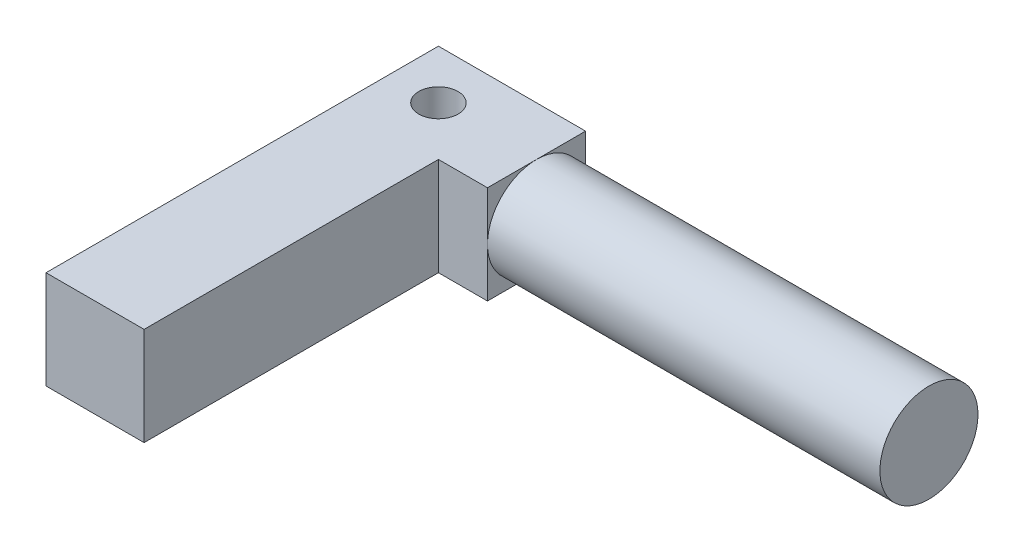
ISO-10303-21;
HEADER;
FILE_DESCRIPTION(('STEP AP214'),'2;1');
FILE_NAME('part.step','',(''),(''),'','','');
FILE_SCHEMA(('AUTOMOTIVE_DESIGN { 1 0 10303 214 1 1 1 1 }'));
ENDSEC;
DATA;
#1=APPLICATION_CONTEXT('core data for automotive mechanical design processes');
#2=APPLICATION_PROTOCOL_DEFINITION('international standard','automotive_design',2000,#1);
#3=PRODUCT_CONTEXT('',#1,'mechanical');
#4=PRODUCT('Part','Part','',(#3));
#5=PRODUCT_RELATED_PRODUCT_CATEGORY('part','',(#4));
#6=PRODUCT_DEFINITION_FORMATION('','',#4);
#7=PRODUCT_DEFINITION_CONTEXT('part definition',#1,'design');
#8=PRODUCT_DEFINITION('design','',#6,#7);
#9=PRODUCT_DEFINITION_SHAPE('','',#8);
#10=(LENGTH_UNIT() NAMED_UNIT(*) SI_UNIT(.MILLI.,.METRE.));
#11=(NAMED_UNIT(*) PLANE_ANGLE_UNIT() SI_UNIT($,.RADIAN.));
#12=(NAMED_UNIT(*) SI_UNIT($,.STERADIAN.) SOLID_ANGLE_UNIT());
#13=UNCERTAINTY_MEASURE_WITH_UNIT(LENGTH_MEASURE(1.E-05),#10,'distance_accuracy_value','');
#14=(GEOMETRIC_REPRESENTATION_CONTEXT(3) GLOBAL_UNCERTAINTY_ASSIGNED_CONTEXT((#13)) GLOBAL_UNIT_ASSIGNED_CONTEXT((#10,
#11,#12)) REPRESENTATION_CONTEXT('',''));
#15=CARTESIAN_POINT('',(0.,0.,0.));
#16=DIRECTION('',(0.,0.,1.));
#17=DIRECTION('',(1.,0.,0.));
#18=AXIS2_PLACEMENT_3D('',#15,#16,#17);
#19=CARTESIAN_POINT('',(50.,50.,-25.));
#20=DIRECTION('',(1.,0.,0.));
#21=DIRECTION('',(0.,0.,-1.));
#22=AXIS2_PLACEMENT_3D('',#19,#20,#21);
#23=PLANE('',#22);
#24=CARTESIAN_POINT('',(50.,25.,0.));
#25=DIRECTION('',(1.,0.,0.));
#26=DIRECTION('',(0.,0.,-1.));
#27=AXIS2_PLACEMENT_3D('',#24,#25,#26);
#28=CIRCLE('',#27,25.);
#29=CARTESIAN_POINT('',(50.,25.,-25.));
#30=VERTEX_POINT('',#29);
#31=CARTESIAN_POINT('',(50.,50.,0.));
#32=VERTEX_POINT('',#31);
#33=EDGE_CURVE('E57',#30,#32,#28,.T.);
#34=ORIENTED_EDGE('',*,*,#33,.F.);
#35=DIRECTION('',(0.,-1.,0.));
#36=VECTOR('',#35,1.);
#37=CARTESIAN_POINT('',(50.,50.,-25.));
#38=LINE('',#37,#36);
#39=CARTESIAN_POINT('',(50.,50.,-25.));
#40=VERTEX_POINT('',#39);
#41=EDGE_CURVE('E112',#40,#30,#38,.T.);
#42=ORIENTED_EDGE('',*,*,#41,.F.);
#43=DIRECTION('',(0.,0.,1.));
#44=VECTOR('',#43,1.);
#45=CARTESIAN_POINT('',(50.,50.,-25.));
#46=LINE('',#45,#44);
#47=EDGE_CURVE('E136',#40,#32,#46,.T.);
#48=ORIENTED_EDGE('',*,*,#47,.T.);
#49=EDGE_LOOP('',(#34,#42,#48));
#50=FACE_BOUND('',#49,.T.);
#51=ADVANCED_FACE('F45',(#50),#23,.T.);
#52=CARTESIAN_POINT('',(50.,25.,25.));
#53=VERTEX_POINT('',#52);
#54=EDGE_CURVE('E11',#32,#53,#28,.T.);
#55=ORIENTED_EDGE('',*,*,#54,.F.);
#56=CARTESIAN_POINT('',(50.,50.,25.));
#57=VERTEX_POINT('',#56);
#58=EDGE_CURVE('E159',#32,#57,#46,.T.);
#59=ORIENTED_EDGE('',*,*,#58,.T.);
#60=DIRECTION('',(0.,-1.,0.));
#61=VECTOR('',#60,1.);
#62=CARTESIAN_POINT('',(50.,50.,25.));
#63=LINE('',#62,#61);
#64=EDGE_CURVE('E49',#57,#53,#63,.T.);
#65=ORIENTED_EDGE('',*,*,#64,.T.);
#66=EDGE_LOOP('',(#55,#59,#65));
#67=FACE_BOUND('',#66,.T.);
#68=ADVANCED_FACE('F245',(#67),#23,.T.);
#69=CARTESIAN_POINT('',(50.,0.,0.));
#70=VERTEX_POINT('',#69);
#71=EDGE_CURVE('E55',#53,#70,#28,.T.);
#72=ORIENTED_EDGE('',*,*,#71,.F.);
#73=CARTESIAN_POINT('',(50.,0.,25.));
#74=VERTEX_POINT('',#73);
#75=EDGE_CURVE('E125',#53,#74,#63,.T.);
#76=ORIENTED_EDGE('',*,*,#75,.T.);
#77=DIRECTION('',(0.,0.,1.));
#78=VECTOR('',#77,1.);
#79=CARTESIAN_POINT('',(50.,0.,-25.));
#80=LINE('',#79,#78);
#81=EDGE_CURVE('E179',#70,#74,#80,.T.);
#82=ORIENTED_EDGE('',*,*,#81,.F.);
#83=EDGE_LOOP('',(#72,#76,#82));
#84=FACE_BOUND('',#83,.T.);
#85=ADVANCED_FACE('F249',(#84),#23,.T.);
#86=CARTESIAN_POINT('',(25.,50.,25.));
#87=DIRECTION('',(0.,0.,-1.));
#88=DIRECTION('',(-1.,0.,0.));
#89=AXIS2_PLACEMENT_3D('',#86,#87,#88);
#90=PLANE('',#89);
#91=DIRECTION('',(1.,0.,0.));
#92=VECTOR('',#91,1.);
#93=CARTESIAN_POINT('',(25.,0.,25.));
#94=LINE('',#93,#92);
#95=CARTESIAN_POINT('',(25.,0.,25.));
#96=VERTEX_POINT('',#95);
#97=EDGE_CURVE('E150',#96,#74,#94,.T.);
#98=ORIENTED_EDGE('',*,*,#97,.T.);
#99=ORIENTED_EDGE('',*,*,#75,.F.);
#100=ORIENTED_EDGE('',*,*,#64,.F.);
#101=DIRECTION('',(1.,0.,0.));
#102=VECTOR('',#101,1.);
#103=CARTESIAN_POINT('',(25.,50.,25.));
#104=LINE('',#103,#102);
#105=CARTESIAN_POINT('',(25.,50.,25.));
#106=VERTEX_POINT('',#105);
#107=EDGE_CURVE('E155',#106,#57,#104,.T.);
#108=ORIENTED_EDGE('',*,*,#107,.F.);
#109=DIRECTION('',(0.,-1.,0.));
#110=VECTOR('',#109,1.);
#111=CARTESIAN_POINT('',(25.,50.,25.));
#112=LINE('',#111,#110);
#113=EDGE_CURVE('E175',#106,#96,#112,.T.);
#114=ORIENTED_EDGE('',*,*,#113,.T.);
#115=EDGE_LOOP('',(#98,#99,#100,#108,#114));
#116=FACE_BOUND('',#115,.T.);
#117=ADVANCED_FACE('F47',(#116),#90,.F.);
#118=EDGE_CURVE('E130',#70,#30,#28,.T.);
#119=ORIENTED_EDGE('',*,*,#118,.F.);
#120=CARTESIAN_POINT('',(50.,0.,-25.));
#121=VERTEX_POINT('',#120);
#122=EDGE_CURVE('E132',#121,#70,#80,.T.);
#123=ORIENTED_EDGE('',*,*,#122,.F.);
#124=EDGE_CURVE('E116',#30,#121,#38,.T.);
#125=ORIENTED_EDGE('',*,*,#124,.F.);
#126=EDGE_LOOP('',(#119,#123,#125));
#127=FACE_BOUND('',#126,.T.);
#128=ADVANCED_FACE('F128',(#127),#23,.T.);
#129=CARTESIAN_POINT('',(-25.,50.,-25.));
#130=DIRECTION('',(0.,0.,-1.));
#131=DIRECTION('',(-1.,0.,0.));
#132=AXIS2_PLACEMENT_3D('',#129,#130,#131);
#133=PLANE('',#132);
#134=DIRECTION('',(1.,0.,0.));
#135=VECTOR('',#134,1.);
#136=CARTESIAN_POINT('',(-25.,0.,-25.));
#137=LINE('',#136,#135);
#138=CARTESIAN_POINT('',(-25.,0.,-25.));
#139=VERTEX_POINT('',#138);
#140=EDGE_CURVE('E182',#139,#121,#137,.T.);
#141=ORIENTED_EDGE('',*,*,#140,.F.);
#142=DIRECTION('',(0.,-1.,0.));
#143=VECTOR('',#142,1.);
#144=CARTESIAN_POINT('',(-25.,50.,-25.));
#145=LINE('',#144,#143);
#146=CARTESIAN_POINT('',(-25.,50.,-25.));
#147=VERTEX_POINT('',#146);
#148=EDGE_CURVE('E134',#147,#139,#145,.T.);
#149=ORIENTED_EDGE('',*,*,#148,.F.);
#150=DIRECTION('',(1.,0.,0.));
#151=VECTOR('',#150,1.);
#152=CARTESIAN_POINT('',(25.,50.,-25.));
#153=LINE('',#152,#151);
#154=EDGE_CURVE('E119',#147,#40,#153,.T.);
#155=ORIENTED_EDGE('',*,*,#154,.T.);
#156=ORIENTED_EDGE('',*,*,#41,.T.);
#157=ORIENTED_EDGE('',*,*,#124,.T.);
#158=EDGE_LOOP('',(#141,#149,#155,#156,#157));
#159=FACE_BOUND('',#158,.T.);
#160=ADVANCED_FACE('F115',(#159),#133,.T.);
#161=CARTESIAN_POINT('',(-25.,50.,-25.));
#162=DIRECTION('',(1.,0.,0.));
#163=DIRECTION('',(0.,0.,-1.));
#164=AXIS2_PLACEMENT_3D('',#161,#162,#163);
#165=PLANE('',#164);
#166=DIRECTION('',(0.,0.,1.));
#167=VECTOR('',#166,1.);
#168=CARTESIAN_POINT('',(-25.,0.,-25.));
#169=LINE('',#168,#167);
#170=CARTESIAN_POINT('',(-25.,0.,175.));
#171=VERTEX_POINT('',#170);
#172=EDGE_CURVE('E185',#139,#171,#169,.T.);
#173=ORIENTED_EDGE('',*,*,#172,.T.);
#174=DIRECTION('',(0.,-1.,0.));
#175=VECTOR('',#174,1.);
#176=CARTESIAN_POINT('',(-25.,50.,175.));
#177=LINE('',#176,#175);
#178=CARTESIAN_POINT('',(-25.,50.,175.));
#179=VERTEX_POINT('',#178);
#180=EDGE_CURVE('E200',#179,#171,#177,.T.);
#181=ORIENTED_EDGE('',*,*,#180,.F.);
#182=DIRECTION('',(0.,0.,1.));
#183=VECTOR('',#182,1.);
#184=CARTESIAN_POINT('',(-25.,50.,-25.));
#185=LINE('',#184,#183);
#186=EDGE_CURVE('E165',#147,#179,#185,.T.);
#187=ORIENTED_EDGE('',*,*,#186,.F.);
#188=ORIENTED_EDGE('',*,*,#148,.T.);
#189=EDGE_LOOP('',(#173,#181,#187,#188));
#190=FACE_BOUND('',#189,.T.);
#191=ADVANCED_FACE('F208',(#190),#165,.F.);
#192=CARTESIAN_POINT('',(-25.,50.,175.));
#193=DIRECTION('',(0.,0.,-1.));
#194=DIRECTION('',(-1.,0.,0.));
#195=AXIS2_PLACEMENT_3D('',#192,#193,#194);
#196=PLANE('',#195);
#197=DIRECTION('',(1.,0.,0.));
#198=VECTOR('',#197,1.);
#199=CARTESIAN_POINT('',(-25.,0.,175.));
#200=LINE('',#199,#198);
#201=CARTESIAN_POINT('',(25.,0.,175.));
#202=VERTEX_POINT('',#201);
#203=EDGE_CURVE('E188',#171,#202,#200,.T.);
#204=ORIENTED_EDGE('',*,*,#203,.T.);
#205=DIRECTION('',(0.,-1.,0.));
#206=VECTOR('',#205,1.);
#207=CARTESIAN_POINT('',(25.,50.,175.));
#208=LINE('',#207,#206);
#209=CARTESIAN_POINT('',(25.,50.,175.));
#210=VERTEX_POINT('',#209);
#211=EDGE_CURVE('E197',#210,#202,#208,.T.);
#212=ORIENTED_EDGE('',*,*,#211,.F.);
#213=DIRECTION('',(1.,0.,0.));
#214=VECTOR('',#213,1.);
#215=CARTESIAN_POINT('',(-25.,50.,175.));
#216=LINE('',#215,#214);
#217=EDGE_CURVE('E168',#179,#210,#216,.T.);
#218=ORIENTED_EDGE('',*,*,#217,.F.);
#219=ORIENTED_EDGE('',*,*,#180,.T.);
#220=EDGE_LOOP('',(#204,#212,#218,#219));
#221=FACE_BOUND('',#220,.T.);
#222=ADVANCED_FACE('F217',(#221),#196,.F.);
#223=CARTESIAN_POINT('',(25.,50.,25.));
#224=DIRECTION('',(1.,0.,0.));
#225=DIRECTION('',(0.,0.,-1.));
#226=AXIS2_PLACEMENT_3D('',#223,#224,#225);
#227=PLANE('',#226);
#228=DIRECTION('',(0.,0.,1.));
#229=VECTOR('',#228,1.);
#230=CARTESIAN_POINT('',(25.,0.,25.));
#231=LINE('',#230,#229);
#232=EDGE_CURVE('E160',#96,#202,#231,.T.);
#233=ORIENTED_EDGE('',*,*,#232,.F.);
#234=ORIENTED_EDGE('',*,*,#113,.F.);
#235=DIRECTION('',(0.,0.,1.));
#236=VECTOR('',#235,1.);
#237=CARTESIAN_POINT('',(25.,50.,25.));
#238=LINE('',#237,#236);
#239=EDGE_CURVE('E171',#106,#210,#238,.T.);
#240=ORIENTED_EDGE('',*,*,#239,.T.);
#241=ORIENTED_EDGE('',*,*,#211,.T.);
#242=EDGE_LOOP('',(#233,#234,#240,#241));
#243=FACE_BOUND('',#242,.T.);
#244=ADVANCED_FACE('F300',(#243),#227,.T.);
#245=CARTESIAN_POINT('',(0.,50.,0.));
#246=DIRECTION('',(0.,-1.,0.));
#247=DIRECTION('',(0.,0.,-1.));
#248=AXIS2_PLACEMENT_3D('',#245,#246,#247);
#249=PLANE('',#248);
#250=CARTESIAN_POINT('',(0.,50.,0.));
#251=DIRECTION('',(0.,-1.,0.));
#252=DIRECTION('',(0.,0.,-1.));
#253=AXIS2_PLACEMENT_3D('',#250,#251,#252);
#254=CIRCLE('',#253,10.);
#255=CARTESIAN_POINT('',(0.,50.,-10.));
#256=VERTEX_POINT('',#255);
#257=EDGE_CURVE('E146',#256,#256,#254,.T.);
#258=ORIENTED_EDGE('',*,*,#257,.T.);
#259=EDGE_LOOP('',(#258));
#260=FACE_BOUND('',#259,.T.);
#261=ORIENTED_EDGE('',*,*,#107,.T.);
#262=ORIENTED_EDGE('',*,*,#58,.F.);
#263=ORIENTED_EDGE('',*,*,#47,.F.);
#264=ORIENTED_EDGE('',*,*,#154,.F.);
#265=ORIENTED_EDGE('',*,*,#186,.T.);
#266=ORIENTED_EDGE('',*,*,#217,.T.);
#267=ORIENTED_EDGE('',*,*,#239,.F.);
#268=EDGE_LOOP('',(#261,#262,#263,#264,#265,#266,#267));
#269=FACE_BOUND('',#268,.T.);
#270=ADVANCED_FACE('F221',(#260,#269),#249,.F.);
#271=CARTESIAN_POINT('',(0.,0.,0.));
#272=DIRECTION('',(0.,-1.,0.));
#273=DIRECTION('',(0.,0.,-1.));
#274=AXIS2_PLACEMENT_3D('',#271,#272,#273);
#275=PLANE('',#274);
#276=CARTESIAN_POINT('',(0.,0.,0.));
#277=DIRECTION('',(0.,-1.,0.));
#278=DIRECTION('',(0.,0.,-1.));
#279=AXIS2_PLACEMENT_3D('',#276,#277,#278);
#280=CIRCLE('',#279,10.);
#281=CARTESIAN_POINT('',(0.,0.,-10.));
#282=VERTEX_POINT('',#281);
#283=EDGE_CURVE('E151',#282,#282,#280,.T.);
#284=ORIENTED_EDGE('',*,*,#283,.F.);
#285=EDGE_LOOP('',(#284));
#286=FACE_BOUND('',#285,.T.);
#287=ORIENTED_EDGE('',*,*,#97,.F.);
#288=ORIENTED_EDGE('',*,*,#232,.T.);
#289=ORIENTED_EDGE('',*,*,#203,.F.);
#290=ORIENTED_EDGE('',*,*,#172,.F.);
#291=ORIENTED_EDGE('',*,*,#140,.T.);
#292=ORIENTED_EDGE('',*,*,#122,.T.);
#293=ORIENTED_EDGE('',*,*,#81,.T.);
#294=EDGE_LOOP('',(#287,#288,#289,#290,#291,#292,#293));
#295=FACE_BOUND('',#294,.T.);
#296=ADVANCED_FACE('F213',(#286,#295),#275,.T.);
#297=CARTESIAN_POINT('',(0.,50.,0.));
#298=DIRECTION('',(0.,-1.,0.));
#299=DIRECTION('',(0.,0.,-1.));
#300=AXIS2_PLACEMENT_3D('',#297,#298,#299);
#301=CYLINDRICAL_SURFACE('',#300,10.);
#302=ORIENTED_EDGE('',*,*,#257,.F.);
#303=EDGE_LOOP('',(#302));
#304=FACE_BOUND('',#303,.T.);
#305=ORIENTED_EDGE('',*,*,#283,.T.);
#306=EDGE_LOOP('',(#305));
#307=FACE_BOUND('',#306,.T.);
#308=ADVANCED_FACE('F234',(#304,#307),#301,.F.);
#309=CARTESIAN_POINT('',(250.,25.,0.));
#310=DIRECTION('',(-1.,0.,0.));
#311=DIRECTION('',(0.,0.,1.));
#312=AXIS2_PLACEMENT_3D('',#309,#310,#311);
#313=CYLINDRICAL_SURFACE('',#312,25.);
#314=CARTESIAN_POINT('',(250.,25.,0.));
#315=DIRECTION('',(1.,0.,0.));
#316=DIRECTION('',(0.,0.,-1.));
#317=AXIS2_PLACEMENT_3D('',#314,#315,#316);
#318=CIRCLE('',#317,25.);
#319=CARTESIAN_POINT('',(250.,25.,-25.));
#320=VERTEX_POINT('',#319);
#321=EDGE_CURVE('E139',#320,#320,#318,.T.);
#322=ORIENTED_EDGE('',*,*,#321,.F.);
#323=EDGE_LOOP('',(#322));
#324=FACE_BOUND('',#323,.T.);
#325=ORIENTED_EDGE('',*,*,#33,.T.);
#326=ORIENTED_EDGE('',*,*,#54,.T.);
#327=ORIENTED_EDGE('',*,*,#71,.T.);
#328=ORIENTED_EDGE('',*,*,#118,.T.);
#329=EDGE_LOOP('',(#325,#326,#327,#328));
#330=FACE_BOUND('',#329,.T.);
#331=ADVANCED_FACE('F140',(#324,#330),#313,.T.);
#332=CARTESIAN_POINT('',(250.,25.,0.));
#333=DIRECTION('',(1.,0.,0.));
#334=DIRECTION('',(0.,0.,-1.));
#335=AXIS2_PLACEMENT_3D('',#332,#333,#334);
#336=PLANE('',#335);
#337=ORIENTED_EDGE('',*,*,#321,.T.);
#338=EDGE_LOOP('',(#337));
#339=FACE_BOUND('',#338,.T.);
#340=ADVANCED_FACE('F231',(#339),#336,.T.);
#341=CLOSED_SHELL('',(#51,#68,#85,#117,#128,#160,#191,#222,#244,#270,#296,#308,#331,#340));
#342=MANIFOLD_SOLID_BREP('B2',#341);
#343=ADVANCED_BREP_SHAPE_REPRESENTATION('',(#18,#342),#14);
#344=SHAPE_DEFINITION_REPRESENTATION(#9,#343);
ENDSEC;
END-ISO-10303-21;
